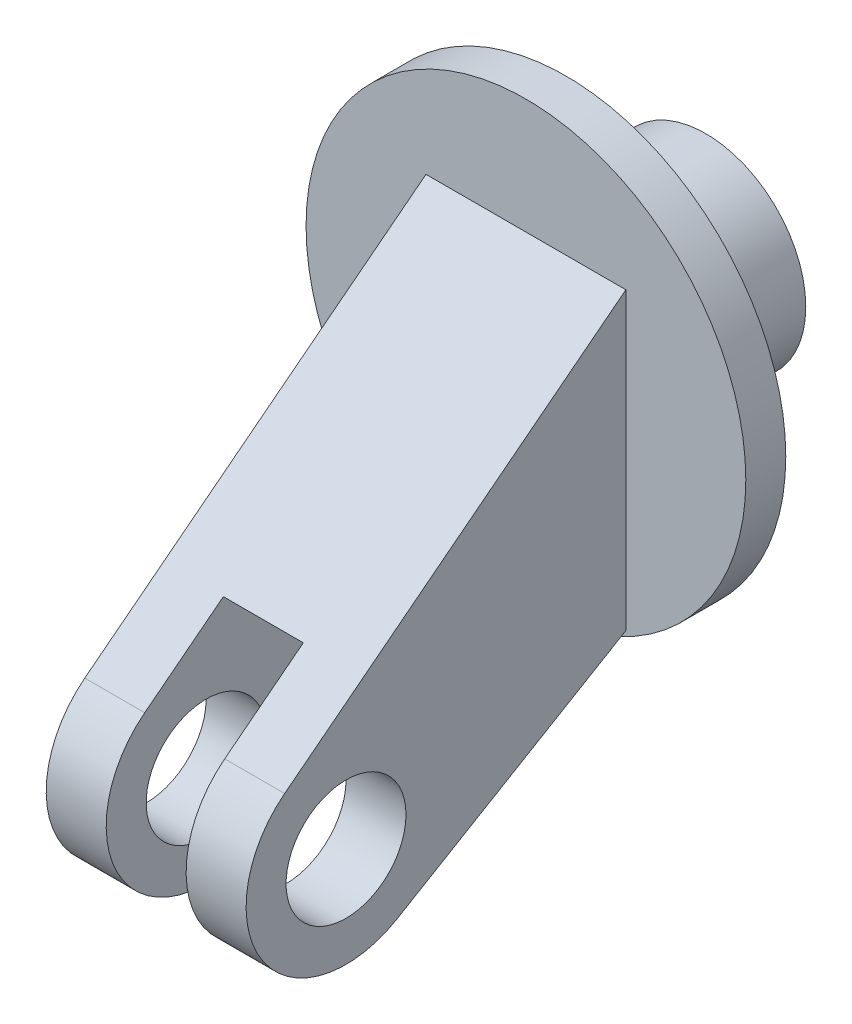
ISO-10303-21;
HEADER;
FILE_DESCRIPTION(('STEP AP214'),'2;1');
FILE_NAME('part.step','',(''),(''),'','','');
FILE_SCHEMA(('AUTOMOTIVE_DESIGN { 1 0 10303 214 1 1 1 1 }'));
ENDSEC;
DATA;
#1=APPLICATION_CONTEXT('core data for automotive mechanical design processes');
#2=APPLICATION_PROTOCOL_DEFINITION('international standard','automotive_design',2000,#1);
#3=PRODUCT_CONTEXT('',#1,'mechanical');
#4=PRODUCT('Part','Part','',(#3));
#5=PRODUCT_RELATED_PRODUCT_CATEGORY('part','',(#4));
#6=PRODUCT_DEFINITION_FORMATION('','',#4);
#7=PRODUCT_DEFINITION_CONTEXT('part definition',#1,'design');
#8=PRODUCT_DEFINITION('design','',#6,#7);
#9=PRODUCT_DEFINITION_SHAPE('','',#8);
#10=(LENGTH_UNIT() NAMED_UNIT(*) SI_UNIT(.MILLI.,.METRE.));
#11=(NAMED_UNIT(*) PLANE_ANGLE_UNIT() SI_UNIT($,.RADIAN.));
#12=(NAMED_UNIT(*) SI_UNIT($,.STERADIAN.) SOLID_ANGLE_UNIT());
#13=UNCERTAINTY_MEASURE_WITH_UNIT(LENGTH_MEASURE(1.E-05),#10,'distance_accuracy_value','');
#14=(GEOMETRIC_REPRESENTATION_CONTEXT(3) GLOBAL_UNCERTAINTY_ASSIGNED_CONTEXT((#13)) GLOBAL_UNIT_ASSIGNED_CONTEXT((#10,
#11,#12)) REPRESENTATION_CONTEXT('',''));
#15=CARTESIAN_POINT('',(0.,0.,0.));
#16=DIRECTION('',(0.,0.,1.));
#17=DIRECTION('',(1.,0.,0.));
#18=AXIS2_PLACEMENT_3D('',#15,#16,#17);
#19=CARTESIAN_POINT('',(25.,21.1440581710036,16.4593102151728));
#20=DIRECTION('',(0.,0.789100184186362,0.614264519012004));
#21=DIRECTION('',(0.,-0.614264519012004,0.789100184186363));
#22=AXIS2_PLACEMENT_3D('',#19,#20,#21);
#23=PLANE('',#22);
#24=DIRECTION('',(-1.,0.,0.));
#25=VECTOR('',#24,1.);
#26=CARTESIAN_POINT('',(25.,-40.2724953953409,95.3566129753001));
#27=LINE('',#26,#25);
#28=CARTESIAN_POINT('',(-10.,-40.2724953953409,95.3566129753001));
#29=VERTEX_POINT('',#28);
#30=CARTESIAN_POINT('',(-25.,-40.2724953953409,95.3566129753001));
#31=VERTEX_POINT('',#30);
#32=EDGE_CURVE('E159',#29,#31,#27,.T.);
#33=ORIENTED_EDGE('',*,*,#32,.F.);
#34=DIRECTION('',(0.,0.614264519012004,-0.789100184186363));
#35=VECTOR('',#34,1.);
#36=CARTESIAN_POINT('',(-10.,21.1440581710036,16.4593102151728));
#37=LINE('',#36,#35);
#38=CARTESIAN_POINT('',(-10.,-24.9616354547846,75.6878839095595));
#39=VERTEX_POINT('',#38);
#40=EDGE_CURVE('E120',#29,#39,#37,.T.);
#41=ORIENTED_EDGE('',*,*,#40,.T.);
#42=DIRECTION('',(1.,0.,0.));
#43=VECTOR('',#42,1.);
#44=CARTESIAN_POINT('',(-10.,-24.9616354547846,75.6878839095594));
#45=LINE('',#44,#43);
#46=CARTESIAN_POINT('',(10.,-24.9616354547846,75.6878839095595));
#47=VERTEX_POINT('',#46);
#48=EDGE_CURVE('E113',#47,#39,#45,.F.);
#49=ORIENTED_EDGE('',*,*,#48,.F.);
#50=DIRECTION('',(0.,0.614264519012004,-0.789100184186363));
#51=VECTOR('',#50,1.);
#52=CARTESIAN_POINT('',(10.,21.1440581710036,16.4593102151728));
#53=LINE('',#52,#51);
#54=CARTESIAN_POINT('',(10.,-40.2724953953409,95.3566129753001));
#55=VERTEX_POINT('',#54);
#56=EDGE_CURVE('E100',#55,#47,#53,.T.);
#57=ORIENTED_EDGE('',*,*,#56,.F.);
#58=CARTESIAN_POINT('',(25.,-40.2724953953409,95.3566129753001));
#59=VERTEX_POINT('',#58);
#60=EDGE_CURVE('E160',#59,#55,#27,.T.);
#61=ORIENTED_EDGE('',*,*,#60,.F.);
#62=DIRECTION('',(0.,0.614264519012004,-0.789100184186363));
#63=VECTOR('',#62,1.);
#64=CARTESIAN_POINT('',(25.,21.1440581710036,16.4593102151728));
#65=LINE('',#64,#63);
#66=CARTESIAN_POINT('',(25.,26.1722220999774,9.99999999999999));
#67=VERTEX_POINT('',#66);
#68=EDGE_CURVE('E128',#59,#67,#65,.T.);
#69=ORIENTED_EDGE('',*,*,#68,.T.);
#70=DIRECTION('',(-1.,0.,0.));
#71=VECTOR('',#70,1.);
#72=CARTESIAN_POINT('',(25.,26.1722220999774,9.99999999999999));
#73=LINE('',#72,#71);
#74=CARTESIAN_POINT('',(-25.,26.1722220999774,10.));
#75=VERTEX_POINT('',#74);
#76=EDGE_CURVE('E140',#67,#75,#73,.T.);
#77=ORIENTED_EDGE('',*,*,#76,.T.);
#78=DIRECTION('',(0.,0.614264519012004,-0.789100184186363));
#79=VECTOR('',#78,1.);
#80=CARTESIAN_POINT('',(-25.,21.1440581710036,16.4593102151728));
#81=LINE('',#80,#79);
#82=EDGE_CURVE('E58',#31,#75,#81,.T.);
#83=ORIENTED_EDGE('',*,*,#82,.F.);
#84=EDGE_LOOP('',(#33,#41,#49,#57,#61,#69,#77,#83));
#85=FACE_BOUND('',#84,.T.);
#86=ADVANCED_FACE('F35',(#85),#23,.T.);
#87=CARTESIAN_POINT('',(25.,-60.,80.));
#88=DIRECTION('',(-1.,0.,0.));
#89=DIRECTION('',(0.,0.,1.));
#90=AXIS2_PLACEMENT_3D('',#87,#88,#89);
#91=CYLINDRICAL_SURFACE('',#90,25.);
#92=CARTESIAN_POINT('',(-10.,-60.,80.));
#93=DIRECTION('',(1.,0.,0.));
#94=DIRECTION('',(0.,0.,-1.));
#95=AXIS2_PLACEMENT_3D('',#92,#93,#94);
#96=CIRCLE('',#95,25.);
#97=CARTESIAN_POINT('',(-10.,-81.5201787738734,67.2767179729235));
#98=VERTEX_POINT('',#97);
#99=EDGE_CURVE('E124',#29,#98,#96,.T.);
#100=ORIENTED_EDGE('',*,*,#99,.F.);
#101=ORIENTED_EDGE('',*,*,#32,.T.);
#102=CARTESIAN_POINT('',(-25.,-60.,80.));
#103=DIRECTION('',(1.,0.,0.));
#104=DIRECTION('',(0.,0.,-1.));
#105=AXIS2_PLACEMENT_3D('',#102,#103,#104);
#106=CIRCLE('',#105,25.);
#107=CARTESIAN_POINT('',(-25.,-81.5201787738734,67.2767179729235));
#108=VERTEX_POINT('',#107);
#109=EDGE_CURVE('E122',#31,#108,#106,.T.);
#110=ORIENTED_EDGE('',*,*,#109,.T.);
#111=DIRECTION('',(-1.,0.,0.));
#112=VECTOR('',#111,1.);
#113=CARTESIAN_POINT('',(25.,-81.5201787738734,67.2767179729235));
#114=LINE('',#113,#112);
#115=EDGE_CURVE('E155',#98,#108,#114,.T.);
#116=ORIENTED_EDGE('',*,*,#115,.F.);
#117=EDGE_LOOP('',(#100,#101,#110,#116));
#118=FACE_BOUND('',#117,.T.);
#119=ADVANCED_FACE('F208',(#118),#91,.T.);
#120=CARTESIAN_POINT('',(25.,-30.9321809539063,-18.2878992839462));
#121=DIRECTION('',(0.,0.860807150954937,0.50893128108306));
#122=DIRECTION('',(0.,-0.50893128108306,0.860807150954937));
#123=AXIS2_PLACEMENT_3D('',#120,#121,#122);
#124=PLANE('',#123);
#125=DIRECTION('',(0.,0.50893128108306,-0.860807150954937));
#126=VECTOR('',#125,1.);
#127=CARTESIAN_POINT('',(-10.,-30.9321809539063,-18.2878992839462));
#128=LINE('',#127,#126);
#129=CARTESIAN_POINT('',(-10.,-68.834804113843,45.8206557779283));
#130=VERTEX_POINT('',#129);
#131=EDGE_CURVE('E177',#98,#130,#128,.T.);
#132=ORIENTED_EDGE('',*,*,#131,.F.);
#133=ORIENTED_EDGE('',*,*,#115,.T.);
#134=DIRECTION('',(0.,0.50893128108306,-0.860807150954937));
#135=VECTOR('',#134,1.);
#136=CARTESIAN_POINT('',(-25.,-30.9321809539063,-18.2878992839462));
#137=LINE('',#136,#135);
#138=CARTESIAN_POINT('',(-25.,-47.6567130465551,10.));
#139=VERTEX_POINT('',#138);
#140=EDGE_CURVE('E144',#108,#139,#137,.T.);
#141=ORIENTED_EDGE('',*,*,#140,.T.);
#142=DIRECTION('',(-1.,0.,0.));
#143=VECTOR('',#142,1.);
#144=CARTESIAN_POINT('',(25.,-47.6567130465551,10.));
#145=LINE('',#144,#143);
#146=CARTESIAN_POINT('',(25.,-47.6567130465551,10.));
#147=VERTEX_POINT('',#146);
#148=EDGE_CURVE('E152',#147,#139,#145,.T.);
#149=ORIENTED_EDGE('',*,*,#148,.F.);
#150=DIRECTION('',(0.,0.50893128108306,-0.860807150954937));
#151=VECTOR('',#150,1.);
#152=CARTESIAN_POINT('',(25.,-30.9321809539063,-18.2878992839462));
#153=LINE('',#152,#151);
#154=CARTESIAN_POINT('',(25.,-81.5201787738734,67.2767179729235));
#155=VERTEX_POINT('',#154);
#156=EDGE_CURVE('E134',#155,#147,#153,.T.);
#157=ORIENTED_EDGE('',*,*,#156,.F.);
#158=CARTESIAN_POINT('',(10.,-81.5201787738734,67.2767179729235));
#159=VERTEX_POINT('',#158);
#160=EDGE_CURVE('E156',#155,#159,#114,.T.);
#161=ORIENTED_EDGE('',*,*,#160,.T.);
#162=DIRECTION('',(0.,0.50893128108306,-0.860807150954937));
#163=VECTOR('',#162,1.);
#164=CARTESIAN_POINT('',(10.,-30.9321809539063,-18.2878992839462));
#165=LINE('',#164,#163);
#166=CARTESIAN_POINT('',(10.,-68.834804113843,45.8206557779283));
#167=VERTEX_POINT('',#166);
#168=EDGE_CURVE('E175',#159,#167,#165,.T.);
#169=ORIENTED_EDGE('',*,*,#168,.T.);
#170=DIRECTION('',(1.,0.,0.));
#171=VECTOR('',#170,1.);
#172=CARTESIAN_POINT('',(-10.,-68.834804113843,45.8206557779283));
#173=LINE('',#172,#171);
#174=EDGE_CURVE('E11',#167,#130,#173,.F.);
#175=ORIENTED_EDGE('',*,*,#174,.T.);
#176=EDGE_LOOP('',(#132,#133,#141,#149,#157,#161,#169,#175));
#177=FACE_BOUND('',#176,.T.);
#178=ADVANCED_FACE('F189',(#177),#124,.F.);
#179=CARTESIAN_POINT('',(25.,-60.,80.));
#180=DIRECTION('',(-1.,0.,0.));
#181=DIRECTION('',(0.,0.,1.));
#182=AXIS2_PLACEMENT_3D('',#179,#180,#181);
#183=CYLINDRICAL_SURFACE('',#182,15.);
#184=CARTESIAN_POINT('',(-25.,-60.,80.));
#185=DIRECTION('',(1.,0.,0.));
#186=DIRECTION('',(0.,0.,-1.));
#187=AXIS2_PLACEMENT_3D('',#184,#185,#186);
#188=CIRCLE('',#187,15.);
#189=CARTESIAN_POINT('',(-25.,-60.,65.));
#190=VERTEX_POINT('',#189);
#191=EDGE_CURVE('E132',#190,#190,#188,.T.);
#192=ORIENTED_EDGE('',*,*,#191,.F.);
#193=EDGE_LOOP('',(#192));
#194=FACE_BOUND('',#193,.T.);
#195=CARTESIAN_POINT('',(-10.,-60.,80.));
#196=DIRECTION('',(1.,0.,0.));
#197=DIRECTION('',(0.,0.,-1.));
#198=AXIS2_PLACEMENT_3D('',#195,#196,#197);
#199=CIRCLE('',#198,15.);
#200=CARTESIAN_POINT('',(-10.,-60.,65.));
#201=VERTEX_POINT('',#200);
#202=EDGE_CURVE('E108',#201,#201,#199,.T.);
#203=ORIENTED_EDGE('',*,*,#202,.T.);
#204=EDGE_LOOP('',(#203));
#205=FACE_BOUND('',#204,.T.);
#206=ADVANCED_FACE('F215',(#194,#205),#183,.F.);
#207=CARTESIAN_POINT('',(0.,0.,10.));
#208=DIRECTION('',(0.,0.,-1.));
#209=DIRECTION('',(-1.,0.,0.));
#210=AXIS2_PLACEMENT_3D('',#207,#208,#209);
#211=CYLINDRICAL_SURFACE('',#210,55.);
#212=CARTESIAN_POINT('',(0.,0.,10.));
#213=DIRECTION('',(0.,0.,1.));
#214=DIRECTION('',(1.,0.,0.));
#215=AXIS2_PLACEMENT_3D('',#212,#213,#214);
#216=CIRCLE('',#215,55.);
#217=CARTESIAN_POINT('',(55.,0.,10.));
#218=VERTEX_POINT('',#217);
#219=EDGE_CURVE('E166',#218,#218,#216,.T.);
#220=ORIENTED_EDGE('',*,*,#219,.F.);
#221=EDGE_LOOP('',(#220));
#222=FACE_BOUND('',#221,.T.);
#223=CARTESIAN_POINT('',(0.,0.,0.));
#224=DIRECTION('',(0.,0.,1.));
#225=DIRECTION('',(1.,0.,0.));
#226=AXIS2_PLACEMENT_3D('',#223,#224,#225);
#227=CIRCLE('',#226,55.);
#228=CARTESIAN_POINT('',(55.,0.,0.));
#229=VERTEX_POINT('',#228);
#230=EDGE_CURVE('E165',#229,#229,#227,.T.);
#231=ORIENTED_EDGE('',*,*,#230,.T.);
#232=EDGE_LOOP('',(#231));
#233=FACE_BOUND('',#232,.T.);
#234=ADVANCED_FACE('F37',(#222,#233),#211,.T.);
#235=CARTESIAN_POINT('',(0.,0.,10.));
#236=DIRECTION('',(0.,0.,1.));
#237=DIRECTION('',(1.,0.,0.));
#238=AXIS2_PLACEMENT_3D('',#235,#236,#237);
#239=PLANE('',#238);
#240=DIRECTION('',(0.,1.,0.));
#241=VECTOR('',#240,1.);
#242=CARTESIAN_POINT('',(25.,0.,10.));
#243=LINE('',#242,#241);
#244=EDGE_CURVE('E136',#147,#67,#243,.T.);
#245=ORIENTED_EDGE('',*,*,#244,.F.);
#246=ORIENTED_EDGE('',*,*,#148,.T.);
#247=DIRECTION('',(0.,1.,0.));
#248=VECTOR('',#247,1.);
#249=CARTESIAN_POINT('',(-25.,0.,10.));
#250=LINE('',#249,#248);
#251=EDGE_CURVE('E146',#139,#75,#250,.T.);
#252=ORIENTED_EDGE('',*,*,#251,.T.);
#253=ORIENTED_EDGE('',*,*,#76,.F.);
#254=EDGE_LOOP('',(#245,#246,#252,#253));
#255=FACE_BOUND('',#254,.T.);
#256=ORIENTED_EDGE('',*,*,#219,.T.);
#257=EDGE_LOOP('',(#256));
#258=FACE_BOUND('',#257,.T.);
#259=ADVANCED_FACE('F201',(#255,#258),#239,.T.);
#260=CARTESIAN_POINT('',(0.,0.,0.));
#261=DIRECTION('',(0.,0.,1.));
#262=DIRECTION('',(1.,0.,0.));
#263=AXIS2_PLACEMENT_3D('',#260,#261,#262);
#264=PLANE('',#263);
#265=CARTESIAN_POINT('',(0.,0.,0.));
#266=DIRECTION('',(0.,0.,1.));
#267=DIRECTION('',(1.,0.,0.));
#268=AXIS2_PLACEMENT_3D('',#265,#266,#267);
#269=CIRCLE('',#268,25.);
#270=CARTESIAN_POINT('',(25.,0.,0.));
#271=VERTEX_POINT('',#270);
#272=EDGE_CURVE('E43',#271,#271,#269,.F.);
#273=ORIENTED_EDGE('',*,*,#272,.F.);
#274=EDGE_LOOP('',(#273));
#275=FACE_BOUND('',#274,.T.);
#276=ORIENTED_EDGE('',*,*,#230,.F.);
#277=EDGE_LOOP('',(#276));
#278=FACE_BOUND('',#277,.T.);
#279=ADVANCED_FACE('F234',(#275,#278),#264,.F.);
#280=CARTESIAN_POINT('',(0.,0.,-35.));
#281=DIRECTION('',(0.,0.,1.));
#282=DIRECTION('',(1.,0.,0.));
#283=AXIS2_PLACEMENT_3D('',#280,#281,#282);
#284=CYLINDRICAL_SURFACE('',#283,25.);
#285=CARTESIAN_POINT('',(0.,0.,-35.));
#286=DIRECTION('',(0.,0.,-1.));
#287=DIRECTION('',(-1.,0.,0.));
#288=AXIS2_PLACEMENT_3D('',#285,#286,#287);
#289=CIRCLE('',#288,25.);
#290=CARTESIAN_POINT('',(-25.,0.,-35.));
#291=VERTEX_POINT('',#290);
#292=EDGE_CURVE('E162',#291,#291,#289,.T.);
#293=ORIENTED_EDGE('',*,*,#292,.F.);
#294=EDGE_LOOP('',(#293));
#295=FACE_BOUND('',#294,.T.);
#296=ORIENTED_EDGE('',*,*,#272,.T.);
#297=EDGE_LOOP('',(#296));
#298=FACE_BOUND('',#297,.T.);
#299=ADVANCED_FACE('F228',(#295,#298),#284,.T.);
#300=CARTESIAN_POINT('',(0.,0.,-35.));
#301=DIRECTION('',(0.,0.,-1.));
#302=DIRECTION('',(-1.,0.,0.));
#303=AXIS2_PLACEMENT_3D('',#300,#301,#302);
#304=PLANE('',#303);
#305=ORIENTED_EDGE('',*,*,#292,.T.);
#306=EDGE_LOOP('',(#305));
#307=FACE_BOUND('',#306,.T.);
#308=ADVANCED_FACE('F220',(#307),#304,.T.);
#309=ORIENTED_EDGE('',*,*,#60,.T.);
#310=CARTESIAN_POINT('',(10.,-60.,80.));
#311=DIRECTION('',(1.,0.,0.));
#312=DIRECTION('',(0.,0.,-1.));
#313=AXIS2_PLACEMENT_3D('',#310,#311,#312);
#314=CIRCLE('',#313,25.);
#315=EDGE_CURVE('E104',#55,#159,#314,.T.);
#316=ORIENTED_EDGE('',*,*,#315,.T.);
#317=ORIENTED_EDGE('',*,*,#160,.F.);
#318=CARTESIAN_POINT('',(25.,-60.,80.));
#319=DIRECTION('',(1.,0.,0.));
#320=DIRECTION('',(0.,0.,-1.));
#321=AXIS2_PLACEMENT_3D('',#318,#319,#320);
#322=CIRCLE('',#321,25.);
#323=EDGE_CURVE('E131',#59,#155,#322,.T.);
#324=ORIENTED_EDGE('',*,*,#323,.F.);
#325=EDGE_LOOP('',(#309,#316,#317,#324));
#326=FACE_BOUND('',#325,.T.);
#327=ADVANCED_FACE('F194',(#326),#91,.T.);
#328=CARTESIAN_POINT('',(10.,-60.,80.));
#329=DIRECTION('',(1.,0.,0.));
#330=DIRECTION('',(0.,0.,-1.));
#331=AXIS2_PLACEMENT_3D('',#328,#329,#330);
#332=CIRCLE('',#331,15.);
#333=CARTESIAN_POINT('',(10.,-60.,65.));
#334=VERTEX_POINT('',#333);
#335=EDGE_CURVE('E173',#334,#334,#332,.T.);
#336=ORIENTED_EDGE('',*,*,#335,.F.);
#337=EDGE_LOOP('',(#336));
#338=FACE_BOUND('',#337,.T.);
#339=CARTESIAN_POINT('',(25.,-60.,80.));
#340=DIRECTION('',(1.,0.,0.));
#341=DIRECTION('',(0.,0.,-1.));
#342=AXIS2_PLACEMENT_3D('',#339,#340,#341);
#343=CIRCLE('',#342,15.);
#344=CARTESIAN_POINT('',(25.,-60.,65.));
#345=VERTEX_POINT('',#344);
#346=EDGE_CURVE('E138',#345,#345,#343,.T.);
#347=ORIENTED_EDGE('',*,*,#346,.T.);
#348=EDGE_LOOP('',(#347));
#349=FACE_BOUND('',#348,.T.);
#350=ADVANCED_FACE('F219',(#338,#349),#183,.F.);
#351=CARTESIAN_POINT('',(25.,0.,0.));
#352=DIRECTION('',(1.,0.,0.));
#353=DIRECTION('',(0.,0.,-1.));
#354=AXIS2_PLACEMENT_3D('',#351,#352,#353);
#355=PLANE('',#354);
#356=ORIENTED_EDGE('',*,*,#68,.F.);
#357=ORIENTED_EDGE('',*,*,#323,.T.);
#358=ORIENTED_EDGE('',*,*,#156,.T.);
#359=ORIENTED_EDGE('',*,*,#244,.T.);
#360=EDGE_LOOP('',(#356,#357,#358,#359));
#361=FACE_BOUND('',#360,.T.);
#362=ORIENTED_EDGE('',*,*,#346,.F.);
#363=EDGE_LOOP('',(#362));
#364=FACE_BOUND('',#363,.T.);
#365=ADVANCED_FACE('F225',(#361,#364),#355,.T.);
#366=CARTESIAN_POINT('',(-25.,0.,0.));
#367=DIRECTION('',(1.,0.,0.));
#368=DIRECTION('',(0.,0.,-1.));
#369=AXIS2_PLACEMENT_3D('',#366,#367,#368);
#370=PLANE('',#369);
#371=ORIENTED_EDGE('',*,*,#82,.T.);
#372=ORIENTED_EDGE('',*,*,#251,.F.);
#373=ORIENTED_EDGE('',*,*,#140,.F.);
#374=ORIENTED_EDGE('',*,*,#109,.F.);
#375=EDGE_LOOP('',(#371,#372,#373,#374));
#376=FACE_BOUND('',#375,.T.);
#377=ORIENTED_EDGE('',*,*,#191,.T.);
#378=EDGE_LOOP('',(#377));
#379=FACE_BOUND('',#378,.T.);
#380=ADVANCED_FACE('F205',(#376,#379),#370,.F.);
#381=CARTESIAN_POINT('',(-10.,-60.,80.));
#382=DIRECTION('',(1.,0.,0.));
#383=DIRECTION('',(0.,0.,-1.));
#384=AXIS2_PLACEMENT_3D('',#381,#382,#383);
#385=CYLINDRICAL_SURFACE('',#384,35.3027100260142);
#386=ORIENTED_EDGE('',*,*,#48,.T.);
#387=CARTESIAN_POINT('',(-10.,-60.,80.));
#388=DIRECTION('',(1.,0.,0.));
#389=DIRECTION('',(0.,0.,-1.));
#390=AXIS2_PLACEMENT_3D('',#387,#388,#389);
#391=CIRCLE('',#390,35.3027100260142);
#392=EDGE_CURVE('E116',#130,#39,#391,.T.);
#393=ORIENTED_EDGE('',*,*,#392,.F.);
#394=ORIENTED_EDGE('',*,*,#174,.F.);
#395=CARTESIAN_POINT('',(10.,-60.,80.));
#396=DIRECTION('',(1.,0.,0.));
#397=DIRECTION('',(0.,0.,-1.));
#398=AXIS2_PLACEMENT_3D('',#395,#396,#397);
#399=CIRCLE('',#398,35.3027100260142);
#400=EDGE_CURVE('E50',#167,#47,#399,.T.);
#401=ORIENTED_EDGE('',*,*,#400,.T.);
#402=EDGE_LOOP('',(#386,#393,#394,#401));
#403=FACE_BOUND('',#402,.T.);
#404=ADVANCED_FACE('F111',(#403),#385,.F.);
#405=CARTESIAN_POINT('',(-10.,-60.,80.));
#406=DIRECTION('',(1.,0.,0.));
#407=DIRECTION('',(0.,0.,-1.));
#408=AXIS2_PLACEMENT_3D('',#405,#406,#407);
#409=PLANE('',#408);
#410=ORIENTED_EDGE('',*,*,#202,.F.);
#411=EDGE_LOOP('',(#410));
#412=FACE_BOUND('',#411,.T.);
#413=ORIENTED_EDGE('',*,*,#99,.T.);
#414=ORIENTED_EDGE('',*,*,#131,.T.);
#415=ORIENTED_EDGE('',*,*,#392,.T.);
#416=ORIENTED_EDGE('',*,*,#40,.F.);
#417=EDGE_LOOP('',(#413,#414,#415,#416));
#418=FACE_BOUND('',#417,.T.);
#419=ADVANCED_FACE('F186',(#412,#418),#409,.T.);
#420=CARTESIAN_POINT('',(10.,-60.,80.));
#421=DIRECTION('',(1.,0.,0.));
#422=DIRECTION('',(0.,0.,-1.));
#423=AXIS2_PLACEMENT_3D('',#420,#421,#422);
#424=PLANE('',#423);
#425=ORIENTED_EDGE('',*,*,#56,.T.);
#426=ORIENTED_EDGE('',*,*,#400,.F.);
#427=ORIENTED_EDGE('',*,*,#168,.F.);
#428=ORIENTED_EDGE('',*,*,#315,.F.);
#429=EDGE_LOOP('',(#425,#426,#427,#428));
#430=FACE_BOUND('',#429,.T.);
#431=ORIENTED_EDGE('',*,*,#335,.T.);
#432=EDGE_LOOP('',(#431));
#433=FACE_BOUND('',#432,.T.);
#434=ADVANCED_FACE('F101',(#430,#433),#424,.F.);
#435=CLOSED_SHELL('',(#86,#119,#178,#206,#234,#259,#279,#299,#308,#327,#350,#365,#380,#404,#419,#434));
#436=MANIFOLD_SOLID_BREP('B2',#435);
#437=ADVANCED_BREP_SHAPE_REPRESENTATION('',(#18,#436),#14);
#438=SHAPE_DEFINITION_REPRESENTATION(#9,#437);
ENDSEC;
END-ISO-10303-21;
